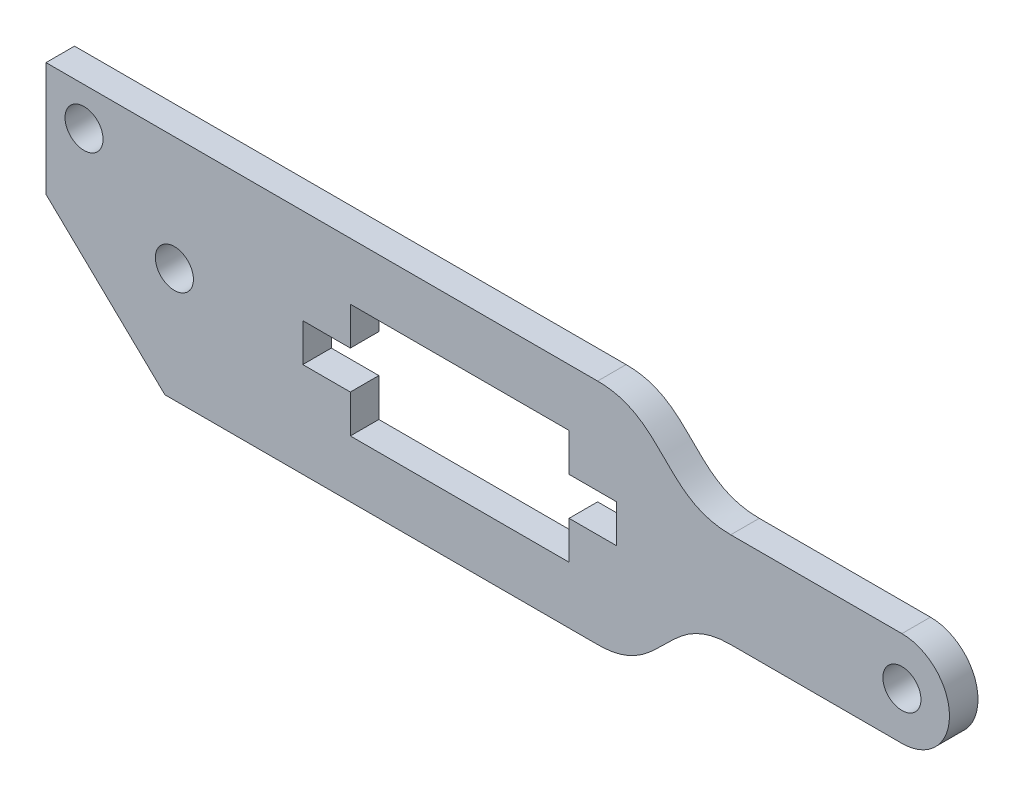
ISO-10303-21;
HEADER;
FILE_DESCRIPTION(('STEP AP214'),'2;1');
FILE_NAME('part.step','',(''),(''),'','','');
FILE_SCHEMA(('AUTOMOTIVE_DESIGN { 1 0 10303 214 1 1 1 1 }'));
ENDSEC;
DATA;
#1=APPLICATION_CONTEXT('core data for automotive mechanical design processes');
#2=APPLICATION_PROTOCOL_DEFINITION('international standard','automotive_design',2000,#1);
#3=PRODUCT_CONTEXT('',#1,'mechanical');
#4=PRODUCT('Part','Part','',(#3));
#5=PRODUCT_RELATED_PRODUCT_CATEGORY('part','',(#4));
#6=PRODUCT_DEFINITION_FORMATION('','',#4);
#7=PRODUCT_DEFINITION_CONTEXT('part definition',#1,'design');
#8=PRODUCT_DEFINITION('design','',#6,#7);
#9=PRODUCT_DEFINITION_SHAPE('','',#8);
#10=(LENGTH_UNIT() NAMED_UNIT(*) SI_UNIT(.MILLI.,.METRE.));
#11=(NAMED_UNIT(*) PLANE_ANGLE_UNIT() SI_UNIT($,.RADIAN.));
#12=(NAMED_UNIT(*) SI_UNIT($,.STERADIAN.) SOLID_ANGLE_UNIT());
#13=UNCERTAINTY_MEASURE_WITH_UNIT(LENGTH_MEASURE(1.E-05),#10,'distance_accuracy_value','');
#14=(GEOMETRIC_REPRESENTATION_CONTEXT(3) GLOBAL_UNCERTAINTY_ASSIGNED_CONTEXT((#13)) GLOBAL_UNIT_ASSIGNED_CONTEXT((#10,
#11,#12)) REPRESENTATION_CONTEXT('',''));
#15=CARTESIAN_POINT('',(0.,0.,0.));
#16=DIRECTION('',(0.,0.,1.));
#17=DIRECTION('',(1.,0.,0.));
#18=AXIS2_PLACEMENT_3D('',#15,#16,#17);
#19=CARTESIAN_POINT('',(0.,1.99999999999999,3.));
#20=DIRECTION('',(0.,1.,0.));
#21=DIRECTION('',(-1.,0.,0.));
#22=AXIS2_PLACEMENT_3D('',#19,#20,#21);
#23=PLANE('',#22);
#24=DIRECTION('',(1.,0.,0.));
#25=VECTOR('',#24,1.);
#26=CARTESIAN_POINT('',(0.,1.99999999999999,0.));
#27=LINE('',#26,#25);
#28=CARTESIAN_POINT('',(7.49999999999999,2.,0.));
#29=VERTEX_POINT('',#28);
#30=CARTESIAN_POINT('',(12.5,2.,0.));
#31=VERTEX_POINT('',#30);
#32=EDGE_CURVE('E348',#29,#31,#27,.T.);
#33=ORIENTED_EDGE('',*,*,#32,.T.);
#34=DIRECTION('',(0.,0.,-1.));
#35=VECTOR('',#34,1.);
#36=CARTESIAN_POINT('',(12.5,2.,3.));
#37=LINE('',#36,#35);
#38=CARTESIAN_POINT('',(12.5,2.,3.));
#39=VERTEX_POINT('',#38);
#40=EDGE_CURVE('E11',#39,#31,#37,.T.);
#41=ORIENTED_EDGE('',*,*,#40,.F.);
#42=DIRECTION('',(1.,0.,0.));
#43=VECTOR('',#42,1.);
#44=CARTESIAN_POINT('',(0.,1.99999999999999,3.));
#45=LINE('',#44,#43);
#46=CARTESIAN_POINT('',(7.49999999999999,2.,3.));
#47=VERTEX_POINT('',#46);
#48=EDGE_CURVE('E232',#47,#39,#45,.T.);
#49=ORIENTED_EDGE('',*,*,#48,.F.);
#50=DIRECTION('',(0.,0.,-1.));
#51=VECTOR('',#50,1.);
#52=CARTESIAN_POINT('',(7.49999999999999,2.,3.));
#53=LINE('',#52,#51);
#54=EDGE_CURVE('E379',#47,#29,#53,.T.);
#55=ORIENTED_EDGE('',*,*,#54,.T.);
#56=EDGE_LOOP('',(#33,#41,#49,#55));
#57=FACE_BOUND('',#56,.T.);
#58=ADVANCED_FACE('F35',(#57),#23,.F.);
#59=CARTESIAN_POINT('',(12.5,0.,3.));
#60=DIRECTION('',(1.,0.,0.));
#61=DIRECTION('',(0.,0.,-1.));
#62=AXIS2_PLACEMENT_3D('',#59,#60,#61);
#63=PLANE('',#62);
#64=DIRECTION('',(0.,-1.,0.));
#65=VECTOR('',#64,1.);
#66=CARTESIAN_POINT('',(12.5,0.,0.));
#67=LINE('',#66,#65);
#68=CARTESIAN_POINT('',(12.5,-2.,0.));
#69=VERTEX_POINT('',#68);
#70=EDGE_CURVE('E350',#31,#69,#67,.T.);
#71=ORIENTED_EDGE('',*,*,#70,.T.);
#72=DIRECTION('',(0.,0.,-1.));
#73=VECTOR('',#72,1.);
#74=CARTESIAN_POINT('',(12.5,-2.,3.));
#75=LINE('',#74,#73);
#76=CARTESIAN_POINT('',(12.5,-2.,3.));
#77=VERTEX_POINT('',#76);
#78=EDGE_CURVE('E46',#77,#69,#75,.T.);
#79=ORIENTED_EDGE('',*,*,#78,.F.);
#80=DIRECTION('',(0.,-1.,0.));
#81=VECTOR('',#80,1.);
#82=CARTESIAN_POINT('',(12.5,0.,3.));
#83=LINE('',#82,#81);
#84=EDGE_CURVE('E230',#39,#77,#83,.T.);
#85=ORIENTED_EDGE('',*,*,#84,.F.);
#86=ORIENTED_EDGE('',*,*,#40,.T.);
#87=EDGE_LOOP('',(#71,#79,#85,#86));
#88=FACE_BOUND('',#87,.T.);
#89=ADVANCED_FACE('F283',(#88),#63,.F.);
#90=CARTESIAN_POINT('',(0.,-2.00000000000001,3.));
#91=DIRECTION('',(0.,1.,0.));
#92=DIRECTION('',(-1.,0.,0.));
#93=AXIS2_PLACEMENT_3D('',#90,#91,#92);
#94=PLANE('',#93);
#95=DIRECTION('',(1.,0.,0.));
#96=VECTOR('',#95,1.);
#97=CARTESIAN_POINT('',(0.,-2.00000000000001,0.));
#98=LINE('',#97,#96);
#99=CARTESIAN_POINT('',(7.5,-2.00000000000001,0.));
#100=VERTEX_POINT('',#99);
#101=EDGE_CURVE('E353',#100,#69,#98,.T.);
#102=ORIENTED_EDGE('',*,*,#101,.F.);
#103=DIRECTION('',(0.,0.,-1.));
#104=VECTOR('',#103,1.);
#105=CARTESIAN_POINT('',(7.5,-2.00000000000001,3.));
#106=LINE('',#105,#104);
#107=CARTESIAN_POINT('',(7.5,-2.00000000000001,3.));
#108=VERTEX_POINT('',#107);
#109=EDGE_CURVE('E393',#108,#100,#106,.T.);
#110=ORIENTED_EDGE('',*,*,#109,.F.);
#111=DIRECTION('',(1.,0.,0.));
#112=VECTOR('',#111,1.);
#113=CARTESIAN_POINT('',(0.,-2.00000000000001,3.));
#114=LINE('',#113,#112);
#115=EDGE_CURVE('E225',#108,#77,#114,.T.);
#116=ORIENTED_EDGE('',*,*,#115,.T.);
#117=ORIENTED_EDGE('',*,*,#78,.T.);
#118=EDGE_LOOP('',(#102,#110,#116,#117));
#119=FACE_BOUND('',#118,.T.);
#120=ADVANCED_FACE('F289',(#119),#94,.T.);
#121=CARTESIAN_POINT('',(7.49999999999999,0.,3.));
#122=DIRECTION('',(1.,0.,0.));
#123=DIRECTION('',(0.,1.,0.));
#124=AXIS2_PLACEMENT_3D('',#121,#122,#123);
#125=PLANE('',#124);
#126=DIRECTION('',(0.,-1.,0.));
#127=VECTOR('',#126,1.);
#128=CARTESIAN_POINT('',(7.49999999999999,0.,0.));
#129=LINE('',#128,#127);
#130=CARTESIAN_POINT('',(7.5,-6.00000000000001,0.));
#131=VERTEX_POINT('',#130);
#132=EDGE_CURVE('E356',#100,#131,#129,.T.);
#133=ORIENTED_EDGE('',*,*,#132,.T.);
#134=DIRECTION('',(0.,0.,-1.));
#135=VECTOR('',#134,1.);
#136=CARTESIAN_POINT('',(7.5,-6.00000000000001,3.));
#137=LINE('',#136,#135);
#138=CARTESIAN_POINT('',(7.5,-6.00000000000001,3.));
#139=VERTEX_POINT('',#138);
#140=EDGE_CURVE('E391',#139,#131,#137,.T.);
#141=ORIENTED_EDGE('',*,*,#140,.F.);
#142=DIRECTION('',(0.,-1.,0.));
#143=VECTOR('',#142,1.);
#144=CARTESIAN_POINT('',(7.49999999999999,0.,3.));
#145=LINE('',#144,#143);
#146=EDGE_CURVE('E222',#108,#139,#145,.T.);
#147=ORIENTED_EDGE('',*,*,#146,.F.);
#148=ORIENTED_EDGE('',*,*,#109,.T.);
#149=EDGE_LOOP('',(#133,#141,#147,#148));
#150=FACE_BOUND('',#149,.T.);
#151=ADVANCED_FACE('F483',(#150),#125,.F.);
#152=CARTESIAN_POINT('',(0.,-6.00000000000001,3.));
#153=DIRECTION('',(0.,1.,0.));
#154=DIRECTION('',(0.,0.,1.));
#155=AXIS2_PLACEMENT_3D('',#152,#153,#154);
#156=PLANE('',#155);
#157=DIRECTION('',(1.,0.,0.));
#158=VECTOR('',#157,1.);
#159=CARTESIAN_POINT('',(0.,-6.00000000000001,0.));
#160=LINE('',#159,#158);
#161=CARTESIAN_POINT('',(-15.5,-6.00000000000001,0.));
#162=VERTEX_POINT('',#161);
#163=EDGE_CURVE('E359',#162,#131,#160,.T.);
#164=ORIENTED_EDGE('',*,*,#163,.F.);
#165=DIRECTION('',(0.,0.,-1.));
#166=VECTOR('',#165,1.);
#167=CARTESIAN_POINT('',(-15.5,-6.00000000000001,3.));
#168=LINE('',#167,#166);
#169=CARTESIAN_POINT('',(-15.5,-6.00000000000001,3.));
#170=VERTEX_POINT('',#169);
#171=EDGE_CURVE('E389',#170,#162,#168,.T.);
#172=ORIENTED_EDGE('',*,*,#171,.F.);
#173=DIRECTION('',(1.,0.,0.));
#174=VECTOR('',#173,1.);
#175=CARTESIAN_POINT('',(0.,-6.00000000000001,3.));
#176=LINE('',#175,#174);
#177=EDGE_CURVE('E218',#170,#139,#176,.T.);
#178=ORIENTED_EDGE('',*,*,#177,.T.);
#179=ORIENTED_EDGE('',*,*,#140,.T.);
#180=EDGE_LOOP('',(#164,#172,#178,#179));
#181=FACE_BOUND('',#180,.T.);
#182=ADVANCED_FACE('F501',(#181),#156,.T.);
#183=CARTESIAN_POINT('',(-15.5,0.,3.));
#184=DIRECTION('',(1.,0.,0.));
#185=DIRECTION('',(0.,1.,0.));
#186=AXIS2_PLACEMENT_3D('',#183,#184,#185);
#187=PLANE('',#186);
#188=DIRECTION('',(0.,-1.,0.));
#189=VECTOR('',#188,1.);
#190=CARTESIAN_POINT('',(-15.5,0.,0.));
#191=LINE('',#190,#189);
#192=CARTESIAN_POINT('',(-15.5,-2.00000000000001,0.));
#193=VERTEX_POINT('',#192);
#194=EDGE_CURVE('E362',#193,#162,#191,.T.);
#195=ORIENTED_EDGE('',*,*,#194,.F.);
#196=DIRECTION('',(0.,0.,-1.));
#197=VECTOR('',#196,1.);
#198=CARTESIAN_POINT('',(-15.5,-2.00000000000001,3.));
#199=LINE('',#198,#197);
#200=CARTESIAN_POINT('',(-15.5,-2.00000000000001,3.));
#201=VERTEX_POINT('',#200);
#202=EDGE_CURVE('E387',#201,#193,#199,.T.);
#203=ORIENTED_EDGE('',*,*,#202,.F.);
#204=DIRECTION('',(0.,-1.,0.));
#205=VECTOR('',#204,1.);
#206=CARTESIAN_POINT('',(-15.5,0.,3.));
#207=LINE('',#206,#205);
#208=EDGE_CURVE('E211',#201,#170,#207,.T.);
#209=ORIENTED_EDGE('',*,*,#208,.T.);
#210=ORIENTED_EDGE('',*,*,#171,.T.);
#211=EDGE_LOOP('',(#195,#203,#209,#210));
#212=FACE_BOUND('',#211,.T.);
#213=ADVANCED_FACE('F489',(#212),#187,.T.);
#214=CARTESIAN_POINT('',(0.,-2.,3.));
#215=DIRECTION('',(0.,-1.,0.));
#216=DIRECTION('',(1.,0.,0.));
#217=AXIS2_PLACEMENT_3D('',#214,#215,#216);
#218=PLANE('',#217);
#219=DIRECTION('',(-1.,0.,0.));
#220=VECTOR('',#219,1.);
#221=CARTESIAN_POINT('',(0.,-2.,0.));
#222=LINE('',#221,#220);
#223=CARTESIAN_POINT('',(-20.5,-2.00000000000001,0.));
#224=VERTEX_POINT('',#223);
#225=EDGE_CURVE('E365',#193,#224,#222,.T.);
#226=ORIENTED_EDGE('',*,*,#225,.T.);
#227=DIRECTION('',(0.,0.,-1.));
#228=VECTOR('',#227,1.);
#229=CARTESIAN_POINT('',(-20.5,-2.00000000000001,3.));
#230=LINE('',#229,#228);
#231=CARTESIAN_POINT('',(-20.5,-2.00000000000001,3.));
#232=VERTEX_POINT('',#231);
#233=EDGE_CURVE('E385',#232,#224,#230,.T.);
#234=ORIENTED_EDGE('',*,*,#233,.F.);
#235=DIRECTION('',(-1.,0.,0.));
#236=VECTOR('',#235,1.);
#237=CARTESIAN_POINT('',(0.,-2.,3.));
#238=LINE('',#237,#236);
#239=EDGE_CURVE('E217',#201,#232,#238,.T.);
#240=ORIENTED_EDGE('',*,*,#239,.F.);
#241=ORIENTED_EDGE('',*,*,#202,.T.);
#242=EDGE_LOOP('',(#226,#234,#240,#241));
#243=FACE_BOUND('',#242,.T.);
#244=ADVANCED_FACE('F496',(#243),#218,.F.);
#245=CARTESIAN_POINT('',(-20.5,0.,3.));
#246=DIRECTION('',(1.,0.,0.));
#247=DIRECTION('',(0.,0.,-1.));
#248=AXIS2_PLACEMENT_3D('',#245,#246,#247);
#249=PLANE('',#248);
#250=DIRECTION('',(0.,-1.,0.));
#251=VECTOR('',#250,1.);
#252=CARTESIAN_POINT('',(-20.5,0.,0.));
#253=LINE('',#252,#251);
#254=CARTESIAN_POINT('',(-20.5,1.99999999999999,0.));
#255=VERTEX_POINT('',#254);
#256=EDGE_CURVE('E368',#255,#224,#253,.T.);
#257=ORIENTED_EDGE('',*,*,#256,.F.);
#258=DIRECTION('',(0.,0.,-1.));
#259=VECTOR('',#258,1.);
#260=CARTESIAN_POINT('',(-20.5,1.99999999999999,3.));
#261=LINE('',#260,#259);
#262=CARTESIAN_POINT('',(-20.5,1.99999999999999,3.));
#263=VERTEX_POINT('',#262);
#264=EDGE_CURVE('E383',#263,#255,#261,.T.);
#265=ORIENTED_EDGE('',*,*,#264,.F.);
#266=DIRECTION('',(0.,-1.,0.));
#267=VECTOR('',#266,1.);
#268=CARTESIAN_POINT('',(-20.5,0.,3.));
#269=LINE('',#268,#267);
#270=EDGE_CURVE('E212',#263,#232,#269,.T.);
#271=ORIENTED_EDGE('',*,*,#270,.T.);
#272=ORIENTED_EDGE('',*,*,#233,.T.);
#273=EDGE_LOOP('',(#257,#265,#271,#272));
#274=FACE_BOUND('',#273,.T.);
#275=ADVANCED_FACE('F492',(#274),#249,.T.);
#276=CARTESIAN_POINT('',(0.,1.99999999999999,3.));
#277=DIRECTION('',(0.,-1.,0.));
#278=DIRECTION('',(0.,0.,-1.));
#279=AXIS2_PLACEMENT_3D('',#276,#277,#278);
#280=PLANE('',#279);
#281=DIRECTION('',(-1.,0.,0.));
#282=VECTOR('',#281,1.);
#283=CARTESIAN_POINT('',(0.,1.99999999999999,0.));
#284=LINE('',#283,#282);
#285=CARTESIAN_POINT('',(-15.5,1.99999999999999,0.));
#286=VERTEX_POINT('',#285);
#287=EDGE_CURVE('E371',#286,#255,#284,.T.);
#288=ORIENTED_EDGE('',*,*,#287,.F.);
#289=DIRECTION('',(0.,0.,-1.));
#290=VECTOR('',#289,1.);
#291=CARTESIAN_POINT('',(-15.5,1.99999999999999,3.));
#292=LINE('',#291,#290);
#293=CARTESIAN_POINT('',(-15.5,1.99999999999999,3.));
#294=VERTEX_POINT('',#293);
#295=EDGE_CURVE('E198',#294,#286,#292,.T.);
#296=ORIENTED_EDGE('',*,*,#295,.F.);
#297=DIRECTION('',(-1.,0.,0.));
#298=VECTOR('',#297,1.);
#299=CARTESIAN_POINT('',(0.,1.99999999999999,3.));
#300=LINE('',#299,#298);
#301=EDGE_CURVE('E209',#294,#263,#300,.T.);
#302=ORIENTED_EDGE('',*,*,#301,.T.);
#303=ORIENTED_EDGE('',*,*,#264,.T.);
#304=EDGE_LOOP('',(#288,#296,#302,#303));
#305=FACE_BOUND('',#304,.T.);
#306=ADVANCED_FACE('F488',(#305),#280,.T.);
#307=CARTESIAN_POINT('',(-15.5,5.99999999999999,0.));
#308=VERTEX_POINT('',#307);
#309=EDGE_CURVE('E197',#308,#286,#191,.T.);
#310=ORIENTED_EDGE('',*,*,#309,.F.);
#311=DIRECTION('',(0.,0.,-1.));
#312=VECTOR('',#311,1.);
#313=CARTESIAN_POINT('',(-15.5,5.99999999999999,3.));
#314=LINE('',#313,#312);
#315=CARTESIAN_POINT('',(-15.5,5.99999999999999,3.));
#316=VERTEX_POINT('',#315);
#317=EDGE_CURVE('E191',#316,#308,#314,.T.);
#318=ORIENTED_EDGE('',*,*,#317,.F.);
#319=EDGE_CURVE('E195',#316,#294,#207,.T.);
#320=ORIENTED_EDGE('',*,*,#319,.T.);
#321=ORIENTED_EDGE('',*,*,#295,.T.);
#322=EDGE_LOOP('',(#310,#318,#320,#321));
#323=FACE_BOUND('',#322,.T.);
#324=ADVANCED_FACE('F193',(#323),#187,.T.);
#325=CARTESIAN_POINT('',(0.,5.99999999999999,3.));
#326=DIRECTION('',(0.,1.,0.));
#327=DIRECTION('',(0.,0.,1.));
#328=AXIS2_PLACEMENT_3D('',#325,#326,#327);
#329=PLANE('',#328);
#330=DIRECTION('',(1.,0.,0.));
#331=VECTOR('',#330,1.);
#332=CARTESIAN_POINT('',(0.,5.99999999999999,0.));
#333=LINE('',#332,#331);
#334=CARTESIAN_POINT('',(7.49999999999999,5.99999999999999,0.));
#335=VERTEX_POINT('',#334);
#336=EDGE_CURVE('E122',#308,#335,#333,.T.);
#337=ORIENTED_EDGE('',*,*,#336,.T.);
#338=DIRECTION('',(0.,0.,-1.));
#339=VECTOR('',#338,1.);
#340=CARTESIAN_POINT('',(7.49999999999999,5.99999999999999,3.));
#341=LINE('',#340,#339);
#342=CARTESIAN_POINT('',(7.49999999999999,5.99999999999999,3.));
#343=VERTEX_POINT('',#342);
#344=EDGE_CURVE('E199',#343,#335,#341,.T.);
#345=ORIENTED_EDGE('',*,*,#344,.F.);
#346=DIRECTION('',(1.,0.,0.));
#347=VECTOR('',#346,1.);
#348=CARTESIAN_POINT('',(0.,5.99999999999999,3.));
#349=LINE('',#348,#347);
#350=EDGE_CURVE('E201',#316,#343,#349,.T.);
#351=ORIENTED_EDGE('',*,*,#350,.F.);
#352=ORIENTED_EDGE('',*,*,#317,.T.);
#353=EDGE_LOOP('',(#337,#345,#351,#352));
#354=FACE_BOUND('',#353,.T.);
#355=ADVANCED_FACE('F202',(#354),#329,.F.);
#356=CARTESIAN_POINT('',(24.5,-5.,3.));
#357=CARTESIAN_POINT('',(17.5,-5.,3.));
#358=CARTESIAN_POINT('',(17.5,-12.,3.));
#359=CARTESIAN_POINT('',(10.5,-12.,3.));
#360=B_SPLINE_CURVE_WITH_KNOTS('',3,(#356,#357,#358,#359),.UNSPECIFIED.,.F.,.F.,(4,4),(0.,1.),.UNSPECIFIED.);
#361=DIRECTION('',(0.,0.,-1.));
#362=VECTOR('',#361,1.);
#363=SURFACE_OF_LINEAR_EXTRUSION('',#360,#362);
#364=CARTESIAN_POINT('',(24.5,-5.,0.));
#365=CARTESIAN_POINT('',(17.5,-5.,0.));
#366=CARTESIAN_POINT('',(17.5,-12.,0.));
#367=CARTESIAN_POINT('',(10.5,-12.,0.));
#368=B_SPLINE_CURVE_WITH_KNOTS('',3,(#364,#365,#366,#367),.UNSPECIFIED.,.F.,.F.,(4,4),(0.,1.),.UNSPECIFIED.);
#369=CARTESIAN_POINT('',(24.5,-5.,0.));
#370=VERTEX_POINT('',#369);
#371=CARTESIAN_POINT('',(10.5,-12.,0.));
#372=VERTEX_POINT('',#371);
#373=EDGE_CURVE('E420',#370,#372,#368,.T.);
#374=ORIENTED_EDGE('',*,*,#373,.F.);
#375=DIRECTION('',(0.,0.,-1.));
#376=VECTOR('',#375,1.);
#377=CARTESIAN_POINT('',(24.5,-5.,3.));
#378=LINE('',#377,#376);
#379=CARTESIAN_POINT('',(24.5,-5.,3.));
#380=VERTEX_POINT('',#379);
#381=EDGE_CURVE('E40',#380,#370,#378,.T.);
#382=ORIENTED_EDGE('',*,*,#381,.F.);
#383=CARTESIAN_POINT('',(10.5,-12.,3.));
#384=VERTEX_POINT('',#383);
#385=EDGE_CURVE('E378',#380,#384,#360,.T.);
#386=ORIENTED_EDGE('',*,*,#385,.T.);
#387=DIRECTION('',(0.,0.,-1.));
#388=VECTOR('',#387,1.);
#389=CARTESIAN_POINT('',(10.5,-12.,3.));
#390=LINE('',#389,#388);
#391=EDGE_CURVE('E396',#384,#372,#390,.T.);
#392=ORIENTED_EDGE('',*,*,#391,.T.);
#393=EDGE_LOOP('',(#374,#382,#386,#392));
#394=FACE_BOUND('',#393,.T.);
#395=ADVANCED_FACE('F37',(#394),#363,.T.);
#396=CARTESIAN_POINT('',(0.,-5.,3.));
#397=DIRECTION('',(0.,-1.,0.));
#398=DIRECTION('',(1.,0.,0.));
#399=AXIS2_PLACEMENT_3D('',#396,#397,#398);
#400=PLANE('',#399);
#401=DIRECTION('',(-1.,0.,0.));
#402=VECTOR('',#401,1.);
#403=CARTESIAN_POINT('',(0.,-5.,0.));
#404=LINE('',#403,#402);
#405=CARTESIAN_POINT('',(42.5,-5.,0.));
#406=VERTEX_POINT('',#405);
#407=EDGE_CURVE('E416',#406,#370,#404,.T.);
#408=ORIENTED_EDGE('',*,*,#407,.F.);
#409=DIRECTION('',(0.,0.,-1.));
#410=VECTOR('',#409,1.);
#411=CARTESIAN_POINT('',(42.5,-5.,3.));
#412=LINE('',#411,#410);
#413=CARTESIAN_POINT('',(42.5,-5.,3.));
#414=VERTEX_POINT('',#413);
#415=EDGE_CURVE('E411',#414,#406,#412,.T.);
#416=ORIENTED_EDGE('',*,*,#415,.F.);
#417=DIRECTION('',(-1.,0.,0.));
#418=VECTOR('',#417,1.);
#419=CARTESIAN_POINT('',(0.,-5.,3.));
#420=LINE('',#419,#418);
#421=EDGE_CURVE('E418',#414,#380,#420,.T.);
#422=ORIENTED_EDGE('',*,*,#421,.T.);
#423=ORIENTED_EDGE('',*,*,#381,.T.);
#424=EDGE_LOOP('',(#408,#416,#422,#423));
#425=FACE_BOUND('',#424,.T.);
#426=ADVANCED_FACE('F274',(#425),#400,.T.);
#427=CARTESIAN_POINT('',(42.5,0.,3.));
#428=DIRECTION('',(0.,0.,-1.));
#429=DIRECTION('',(-1.,0.,0.));
#430=AXIS2_PLACEMENT_3D('',#427,#428,#429);
#431=CYLINDRICAL_SURFACE('',#430,5.);
#432=CARTESIAN_POINT('',(42.5,0.,0.));
#433=DIRECTION('',(0.,0.,1.));
#434=DIRECTION('',(1.,0.,0.));
#435=AXIS2_PLACEMENT_3D('',#432,#433,#434);
#436=CIRCLE('',#435,5.);
#437=CARTESIAN_POINT('',(42.5,5.,0.));
#438=VERTEX_POINT('',#437);
#439=EDGE_CURVE('E426',#406,#438,#436,.T.);
#440=ORIENTED_EDGE('',*,*,#439,.T.);
#441=DIRECTION('',(0.,0.,-1.));
#442=VECTOR('',#441,1.);
#443=CARTESIAN_POINT('',(42.5,5.,3.));
#444=LINE('',#443,#442);
#445=CARTESIAN_POINT('',(42.5,5.,3.));
#446=VERTEX_POINT('',#445);
#447=EDGE_CURVE('E409',#446,#438,#444,.T.);
#448=ORIENTED_EDGE('',*,*,#447,.F.);
#449=CARTESIAN_POINT('',(42.5,0.,3.));
#450=DIRECTION('',(0.,0.,1.));
#451=DIRECTION('',(1.,0.,0.));
#452=AXIS2_PLACEMENT_3D('',#449,#450,#451);
#453=CIRCLE('',#452,5.);
#454=EDGE_CURVE('E448',#414,#446,#453,.T.);
#455=ORIENTED_EDGE('',*,*,#454,.F.);
#456=ORIENTED_EDGE('',*,*,#415,.T.);
#457=EDGE_LOOP('',(#440,#448,#455,#456));
#458=FACE_BOUND('',#457,.T.);
#459=ADVANCED_FACE('F271',(#458),#431,.T.);
#460=CARTESIAN_POINT('',(0.,5.,3.));
#461=DIRECTION('',(0.,-1.,0.));
#462=DIRECTION('',(1.,0.,0.));
#463=AXIS2_PLACEMENT_3D('',#460,#461,#462);
#464=PLANE('',#463);
#465=DIRECTION('',(-1.,0.,0.));
#466=VECTOR('',#465,1.);
#467=CARTESIAN_POINT('',(0.,5.,0.));
#468=LINE('',#467,#466);
#469=CARTESIAN_POINT('',(24.5,5.,0.));
#470=VERTEX_POINT('',#469);
#471=EDGE_CURVE('E428',#438,#470,#468,.T.);
#472=ORIENTED_EDGE('',*,*,#471,.T.);
#473=DIRECTION('',(0.,0.,-1.));
#474=VECTOR('',#473,1.);
#475=CARTESIAN_POINT('',(24.5,5.,3.));
#476=LINE('',#475,#474);
#477=CARTESIAN_POINT('',(24.5,5.,3.));
#478=VERTEX_POINT('',#477);
#479=EDGE_CURVE('E406',#478,#470,#476,.T.);
#480=ORIENTED_EDGE('',*,*,#479,.F.);
#481=DIRECTION('',(-1.,0.,0.));
#482=VECTOR('',#481,1.);
#483=CARTESIAN_POINT('',(0.,5.,3.));
#484=LINE('',#483,#482);
#485=EDGE_CURVE('E255',#446,#478,#484,.T.);
#486=ORIENTED_EDGE('',*,*,#485,.F.);
#487=ORIENTED_EDGE('',*,*,#447,.T.);
#488=EDGE_LOOP('',(#472,#480,#486,#487));
#489=FACE_BOUND('',#488,.T.);
#490=ADVANCED_FACE('F266',(#489),#464,.F.);
#491=CARTESIAN_POINT('',(24.5,5.,3.));
#492=CARTESIAN_POINT('',(17.5,5.,3.));
#493=CARTESIAN_POINT('',(17.5,12.,3.));
#494=CARTESIAN_POINT('',(10.5,12.,3.));
#495=B_SPLINE_CURVE_WITH_KNOTS('',3,(#491,#492,#493,#494),.UNSPECIFIED.,.F.,.F.,(4,4),(0.,1.),.UNSPECIFIED.);
#496=DIRECTION('',(0.,0.,-1.));
#497=VECTOR('',#496,1.);
#498=SURFACE_OF_LINEAR_EXTRUSION('',#495,#497);
#499=CARTESIAN_POINT('',(24.5,5.,0.));
#500=CARTESIAN_POINT('',(17.5,5.,0.));
#501=CARTESIAN_POINT('',(17.5,12.,0.));
#502=CARTESIAN_POINT('',(10.5,12.,0.));
#503=B_SPLINE_CURVE_WITH_KNOTS('',3,(#499,#500,#501,#502),.UNSPECIFIED.,.F.,.F.,(4,4),(0.,1.),.UNSPECIFIED.);
#504=CARTESIAN_POINT('',(10.5,12.,0.));
#505=VERTEX_POINT('',#504);
#506=EDGE_CURVE('E336',#470,#505,#503,.T.);
#507=ORIENTED_EDGE('',*,*,#506,.T.);
#508=DIRECTION('',(0.,0.,-1.));
#509=VECTOR('',#508,1.);
#510=CARTESIAN_POINT('',(10.5,12.,3.));
#511=LINE('',#510,#509);
#512=CARTESIAN_POINT('',(10.5,12.,3.));
#513=VERTEX_POINT('',#512);
#514=EDGE_CURVE('E403',#513,#505,#511,.T.);
#515=ORIENTED_EDGE('',*,*,#514,.F.);
#516=EDGE_CURVE('E250',#478,#513,#495,.T.);
#517=ORIENTED_EDGE('',*,*,#516,.F.);
#518=ORIENTED_EDGE('',*,*,#479,.T.);
#519=EDGE_LOOP('',(#507,#515,#517,#518));
#520=FACE_BOUND('',#519,.T.);
#521=ADVANCED_FACE('F261',(#520),#498,.F.);
#522=CARTESIAN_POINT('',(0.,12.,3.));
#523=DIRECTION('',(0.,-1.,0.));
#524=DIRECTION('',(1.,0.,0.));
#525=AXIS2_PLACEMENT_3D('',#522,#523,#524);
#526=PLANE('',#525);
#527=DIRECTION('',(-1.,0.,0.));
#528=VECTOR('',#527,1.);
#529=CARTESIAN_POINT('',(0.,12.,0.));
#530=LINE('',#529,#528);
#531=CARTESIAN_POINT('',(-47.5,12.,0.));
#532=VERTEX_POINT('',#531);
#533=EDGE_CURVE('E331',#505,#532,#530,.T.);
#534=ORIENTED_EDGE('',*,*,#533,.T.);
#535=DIRECTION('',(0.,0.,-1.));
#536=VECTOR('',#535,1.);
#537=CARTESIAN_POINT('',(-47.5,12.,3.));
#538=LINE('',#537,#536);
#539=CARTESIAN_POINT('',(-47.5,12.,3.));
#540=VERTEX_POINT('',#539);
#541=EDGE_CURVE('E325',#540,#532,#538,.T.);
#542=ORIENTED_EDGE('',*,*,#541,.F.);
#543=DIRECTION('',(-1.,0.,0.));
#544=VECTOR('',#543,1.);
#545=CARTESIAN_POINT('',(0.,12.,3.));
#546=LINE('',#545,#544);
#547=EDGE_CURVE('E248',#513,#540,#546,.T.);
#548=ORIENTED_EDGE('',*,*,#547,.F.);
#549=ORIENTED_EDGE('',*,*,#514,.T.);
#550=EDGE_LOOP('',(#534,#542,#548,#549));
#551=FACE_BOUND('',#550,.T.);
#552=ADVANCED_FACE('F265',(#551),#526,.F.);
#553=CARTESIAN_POINT('',(-47.5,0.,3.));
#554=DIRECTION('',(-1.,0.,0.));
#555=DIRECTION('',(0.,0.,1.));
#556=AXIS2_PLACEMENT_3D('',#553,#554,#555);
#557=PLANE('',#556);
#558=DIRECTION('',(0.,1.,0.));
#559=VECTOR('',#558,1.);
#560=CARTESIAN_POINT('',(-47.5,0.,0.));
#561=LINE('',#560,#559);
#562=CARTESIAN_POINT('',(-47.5,0.,0.));
#563=VERTEX_POINT('',#562);
#564=EDGE_CURVE('E321',#563,#532,#561,.T.);
#565=ORIENTED_EDGE('',*,*,#564,.F.);
#566=DIRECTION('',(0.,0.,-1.));
#567=VECTOR('',#566,1.);
#568=CARTESIAN_POINT('',(-47.5,0.,3.));
#569=LINE('',#568,#567);
#570=CARTESIAN_POINT('',(-47.5,0.,3.));
#571=VERTEX_POINT('',#570);
#572=EDGE_CURVE('E322',#571,#563,#569,.T.);
#573=ORIENTED_EDGE('',*,*,#572,.F.);
#574=DIRECTION('',(0.,1.,0.));
#575=VECTOR('',#574,1.);
#576=CARTESIAN_POINT('',(-47.5,0.,3.));
#577=LINE('',#576,#575);
#578=EDGE_CURVE('E245',#571,#540,#577,.T.);
#579=ORIENTED_EDGE('',*,*,#578,.T.);
#580=ORIENTED_EDGE('',*,*,#541,.T.);
#581=EDGE_LOOP('',(#565,#573,#579,#580));
#582=FACE_BOUND('',#581,.T.);
#583=ADVANCED_FACE('F311',(#582),#557,.T.);
#584=CARTESIAN_POINT('',(-22.7810158201493,-23.7302248126561,3.));
#585=DIRECTION('',(0.692531828189704,0.72138732103096,0.));
#586=DIRECTION('',(-0.72138732103096,0.692531828189704,0.));
#587=AXIS2_PLACEMENT_3D('',#584,#585,#586);
#588=PLANE('',#587);
#589=DIRECTION('',(0.72138732103096,-0.692531828189704,0.));
#590=VECTOR('',#589,1.);
#591=CARTESIAN_POINT('',(-22.7810158201493,-23.7302248126561,0.));
#592=LINE('',#591,#590);
#593=CARTESIAN_POINT('',(-34.9999999999997,-12.,0.));
#594=VERTEX_POINT('',#593);
#595=EDGE_CURVE('E330',#563,#594,#592,.T.);
#596=ORIENTED_EDGE('',*,*,#595,.T.);
#597=DIRECTION('',(0.,0.,-1.));
#598=VECTOR('',#597,1.);
#599=CARTESIAN_POINT('',(-34.9999999999997,-12.,3.));
#600=LINE('',#599,#598);
#601=CARTESIAN_POINT('',(-34.9999999999997,-12.,3.));
#602=VERTEX_POINT('',#601);
#603=EDGE_CURVE('E398',#602,#594,#600,.T.);
#604=ORIENTED_EDGE('',*,*,#603,.F.);
#605=DIRECTION('',(0.72138732103096,-0.692531828189704,0.));
#606=VECTOR('',#605,1.);
#607=CARTESIAN_POINT('',(-22.7810158201493,-23.7302248126561,3.));
#608=LINE('',#607,#606);
#609=EDGE_CURVE('E243',#571,#602,#608,.T.);
#610=ORIENTED_EDGE('',*,*,#609,.F.);
#611=ORIENTED_EDGE('',*,*,#572,.T.);
#612=EDGE_LOOP('',(#596,#604,#610,#611));
#613=FACE_BOUND('',#612,.T.);
#614=ADVANCED_FACE('F309',(#613),#588,.F.);
#615=EDGE_CURVE('E128',#335,#29,#129,.T.);
#616=ORIENTED_EDGE('',*,*,#615,.T.);
#617=ORIENTED_EDGE('',*,*,#54,.F.);
#618=EDGE_CURVE('E55',#343,#47,#145,.T.);
#619=ORIENTED_EDGE('',*,*,#618,.F.);
#620=ORIENTED_EDGE('',*,*,#344,.T.);
#621=EDGE_LOOP('',(#616,#617,#619,#620));
#622=FACE_BOUND('',#621,.T.);
#623=ADVANCED_FACE('F299',(#622),#125,.F.);
#624=CARTESIAN_POINT('',(-34.,0.,3.));
#625=DIRECTION('',(0.,0.,-1.));
#626=DIRECTION('',(-1.,0.,0.));
#627=AXIS2_PLACEMENT_3D('',#624,#625,#626);
#628=CYLINDRICAL_SURFACE('',#627,2.);
#629=CARTESIAN_POINT('',(-34.,0.,3.));
#630=DIRECTION('',(0.,0.,1.));
#631=DIRECTION('',(1.,0.,0.));
#632=AXIS2_PLACEMENT_3D('',#629,#630,#631);
#633=CIRCLE('',#632,2.);
#634=CARTESIAN_POINT('',(-32.,0.,3.));
#635=VERTEX_POINT('',#634);
#636=EDGE_CURVE('E234',#635,#635,#633,.T.);
#637=ORIENTED_EDGE('',*,*,#636,.T.);
#638=EDGE_LOOP('',(#637));
#639=FACE_BOUND('',#638,.T.);
#640=CARTESIAN_POINT('',(-34.,0.,0.));
#641=DIRECTION('',(0.,0.,1.));
#642=DIRECTION('',(1.,0.,0.));
#643=AXIS2_PLACEMENT_3D('',#640,#641,#642);
#644=CIRCLE('',#643,2.);
#645=CARTESIAN_POINT('',(-32.,0.,0.));
#646=VERTEX_POINT('',#645);
#647=EDGE_CURVE('E345',#646,#646,#644,.T.);
#648=ORIENTED_EDGE('',*,*,#647,.F.);
#649=EDGE_LOOP('',(#648));
#650=FACE_BOUND('',#649,.T.);
#651=ADVANCED_FACE('F295',(#639,#650),#628,.F.);
#652=CARTESIAN_POINT('',(-43.5,8.00000000000001,3.));
#653=DIRECTION('',(0.,0.,-1.));
#654=DIRECTION('',(-1.,0.,0.));
#655=AXIS2_PLACEMENT_3D('',#652,#653,#654);
#656=CYLINDRICAL_SURFACE('',#655,2.);
#657=CARTESIAN_POINT('',(-43.5,8.00000000000001,3.));
#658=DIRECTION('',(0.,0.,1.));
#659=DIRECTION('',(1.,0.,0.));
#660=AXIS2_PLACEMENT_3D('',#657,#658,#659);
#661=CIRCLE('',#660,2.);
#662=CARTESIAN_POINT('',(-41.5,8.00000000000001,3.));
#663=VERTEX_POINT('',#662);
#664=EDGE_CURVE('E237',#663,#663,#661,.T.);
#665=ORIENTED_EDGE('',*,*,#664,.T.);
#666=EDGE_LOOP('',(#665));
#667=FACE_BOUND('',#666,.T.);
#668=CARTESIAN_POINT('',(-43.5,8.00000000000001,0.));
#669=DIRECTION('',(0.,0.,1.));
#670=DIRECTION('',(1.,0.,0.));
#671=AXIS2_PLACEMENT_3D('',#668,#669,#670);
#672=CIRCLE('',#671,2.);
#673=CARTESIAN_POINT('',(-41.5,8.00000000000001,0.));
#674=VERTEX_POINT('',#673);
#675=EDGE_CURVE('E342',#674,#674,#672,.T.);
#676=ORIENTED_EDGE('',*,*,#675,.F.);
#677=EDGE_LOOP('',(#676));
#678=FACE_BOUND('',#677,.T.);
#679=ADVANCED_FACE('F298',(#667,#678),#656,.F.);
#680=CARTESIAN_POINT('',(0.,-12.,3.));
#681=DIRECTION('',(0.,-1.,0.));
#682=DIRECTION('',(1.,0.,0.));
#683=AXIS2_PLACEMENT_3D('',#680,#681,#682);
#684=PLANE('',#683);
#685=DIRECTION('',(-1.,0.,0.));
#686=VECTOR('',#685,1.);
#687=CARTESIAN_POINT('',(0.,-12.,0.));
#688=LINE('',#687,#686);
#689=EDGE_CURVE('E334',#372,#594,#688,.T.);
#690=ORIENTED_EDGE('',*,*,#689,.F.);
#691=ORIENTED_EDGE('',*,*,#391,.F.);
#692=DIRECTION('',(-1.,0.,0.));
#693=VECTOR('',#692,1.);
#694=CARTESIAN_POINT('',(0.,-12.,3.));
#695=LINE('',#694,#693);
#696=EDGE_CURVE('E240',#384,#602,#695,.T.);
#697=ORIENTED_EDGE('',*,*,#696,.T.);
#698=ORIENTED_EDGE('',*,*,#603,.T.);
#699=EDGE_LOOP('',(#690,#691,#697,#698));
#700=FACE_BOUND('',#699,.T.);
#701=ADVANCED_FACE('F303',(#700),#684,.T.);
#702=CARTESIAN_POINT('',(42.5,0.,3.));
#703=DIRECTION('',(0.,0.,-1.));
#704=DIRECTION('',(-1.,0.,0.));
#705=AXIS2_PLACEMENT_3D('',#702,#703,#704);
#706=CYLINDRICAL_SURFACE('',#705,2.);
#707=CARTESIAN_POINT('',(42.5,0.,3.));
#708=DIRECTION('',(0.,0.,1.));
#709=DIRECTION('',(1.,0.,0.));
#710=AXIS2_PLACEMENT_3D('',#707,#708,#709);
#711=CIRCLE('',#710,2.);
#712=CARTESIAN_POINT('',(44.5,0.,3.));
#713=VERTEX_POINT('',#712);
#714=EDGE_CURVE('E399',#713,#713,#711,.T.);
#715=ORIENTED_EDGE('',*,*,#714,.T.);
#716=EDGE_LOOP('',(#715));
#717=FACE_BOUND('',#716,.T.);
#718=CARTESIAN_POINT('',(42.5,0.,0.));
#719=DIRECTION('',(0.,0.,1.));
#720=DIRECTION('',(1.,0.,0.));
#721=AXIS2_PLACEMENT_3D('',#718,#719,#720);
#722=CIRCLE('',#721,2.);
#723=CARTESIAN_POINT('',(44.5,0.,0.));
#724=VERTEX_POINT('',#723);
#725=EDGE_CURVE('E375',#724,#724,#722,.T.);
#726=ORIENTED_EDGE('',*,*,#725,.F.);
#727=EDGE_LOOP('',(#726));
#728=FACE_BOUND('',#727,.T.);
#729=ADVANCED_FACE('F307',(#717,#728),#706,.F.);
#730=CARTESIAN_POINT('',(0.,0.,3.));
#731=DIRECTION('',(0.,0.,1.));
#732=DIRECTION('',(1.,0.,0.));
#733=AXIS2_PLACEMENT_3D('',#730,#731,#732);
#734=PLANE('',#733);
#735=ORIENTED_EDGE('',*,*,#385,.F.);
#736=ORIENTED_EDGE('',*,*,#421,.F.);
#737=ORIENTED_EDGE('',*,*,#454,.T.);
#738=ORIENTED_EDGE('',*,*,#485,.T.);
#739=ORIENTED_EDGE('',*,*,#516,.T.);
#740=ORIENTED_EDGE('',*,*,#547,.T.);
#741=ORIENTED_EDGE('',*,*,#578,.F.);
#742=ORIENTED_EDGE('',*,*,#609,.T.);
#743=ORIENTED_EDGE('',*,*,#696,.F.);
#744=EDGE_LOOP('',(#735,#736,#737,#738,#739,#740,#741,#742,#743));
#745=FACE_BOUND('',#744,.T.);
#746=ORIENTED_EDGE('',*,*,#664,.F.);
#747=EDGE_LOOP('',(#746));
#748=FACE_BOUND('',#747,.T.);
#749=ORIENTED_EDGE('',*,*,#636,.F.);
#750=EDGE_LOOP('',(#749));
#751=FACE_BOUND('',#750,.T.);
#752=ORIENTED_EDGE('',*,*,#48,.T.);
#753=ORIENTED_EDGE('',*,*,#84,.T.);
#754=ORIENTED_EDGE('',*,*,#115,.F.);
#755=ORIENTED_EDGE('',*,*,#146,.T.);
#756=ORIENTED_EDGE('',*,*,#177,.F.);
#757=ORIENTED_EDGE('',*,*,#208,.F.);
#758=ORIENTED_EDGE('',*,*,#239,.T.);
#759=ORIENTED_EDGE('',*,*,#270,.F.);
#760=ORIENTED_EDGE('',*,*,#301,.F.);
#761=ORIENTED_EDGE('',*,*,#319,.F.);
#762=ORIENTED_EDGE('',*,*,#350,.T.);
#763=ORIENTED_EDGE('',*,*,#618,.T.);
#764=EDGE_LOOP('',(#752,#753,#754,#755,#756,#757,#758,#759,#760,#761,#762,#763));
#765=FACE_BOUND('',#764,.T.);
#766=ORIENTED_EDGE('',*,*,#714,.F.);
#767=EDGE_LOOP('',(#766));
#768=FACE_BOUND('',#767,.T.);
#769=ADVANCED_FACE('F205',(#745,#748,#751,#765,#768),#734,.T.);
#770=CARTESIAN_POINT('',(0.,0.,0.));
#771=DIRECTION('',(0.,0.,1.));
#772=DIRECTION('',(1.,0.,0.));
#773=AXIS2_PLACEMENT_3D('',#770,#771,#772);
#774=PLANE('',#773);
#775=ORIENTED_EDGE('',*,*,#373,.T.);
#776=ORIENTED_EDGE('',*,*,#689,.T.);
#777=ORIENTED_EDGE('',*,*,#595,.F.);
#778=ORIENTED_EDGE('',*,*,#564,.T.);
#779=ORIENTED_EDGE('',*,*,#533,.F.);
#780=ORIENTED_EDGE('',*,*,#506,.F.);
#781=ORIENTED_EDGE('',*,*,#471,.F.);
#782=ORIENTED_EDGE('',*,*,#439,.F.);
#783=ORIENTED_EDGE('',*,*,#407,.T.);
#784=EDGE_LOOP('',(#775,#776,#777,#778,#779,#780,#781,#782,#783));
#785=FACE_BOUND('',#784,.T.);
#786=ORIENTED_EDGE('',*,*,#675,.T.);
#787=EDGE_LOOP('',(#786));
#788=FACE_BOUND('',#787,.T.);
#789=ORIENTED_EDGE('',*,*,#647,.T.);
#790=EDGE_LOOP('',(#789));
#791=FACE_BOUND('',#790,.T.);
#792=ORIENTED_EDGE('',*,*,#32,.F.);
#793=ORIENTED_EDGE('',*,*,#615,.F.);
#794=ORIENTED_EDGE('',*,*,#336,.F.);
#795=ORIENTED_EDGE('',*,*,#309,.T.);
#796=ORIENTED_EDGE('',*,*,#287,.T.);
#797=ORIENTED_EDGE('',*,*,#256,.T.);
#798=ORIENTED_EDGE('',*,*,#225,.F.);
#799=ORIENTED_EDGE('',*,*,#194,.T.);
#800=ORIENTED_EDGE('',*,*,#163,.T.);
#801=ORIENTED_EDGE('',*,*,#132,.F.);
#802=ORIENTED_EDGE('',*,*,#101,.T.);
#803=ORIENTED_EDGE('',*,*,#70,.F.);
#804=EDGE_LOOP('',(#792,#793,#794,#795,#796,#797,#798,#799,#800,#801,#802,#803));
#805=FACE_BOUND('',#804,.T.);
#806=ORIENTED_EDGE('',*,*,#725,.T.);
#807=EDGE_LOOP('',(#806));
#808=FACE_BOUND('',#807,.T.);
#809=ADVANCED_FACE('F423',(#785,#788,#791,#805,#808),#774,.F.);
#810=CLOSED_SHELL('',(#58,#89,#120,#151,#182,#213,#244,#275,#306,#324,#355,#395,#426,#459,#490,
#521,#552,#583,#614,#623,#651,#679,#701,#729,#769,#809));
#811=MANIFOLD_SOLID_BREP('B2',#810);
#812=ADVANCED_BREP_SHAPE_REPRESENTATION('',(#18,#811),#14);
#813=SHAPE_DEFINITION_REPRESENTATION(#9,#812);
ENDSEC;
END-ISO-10303-21;
